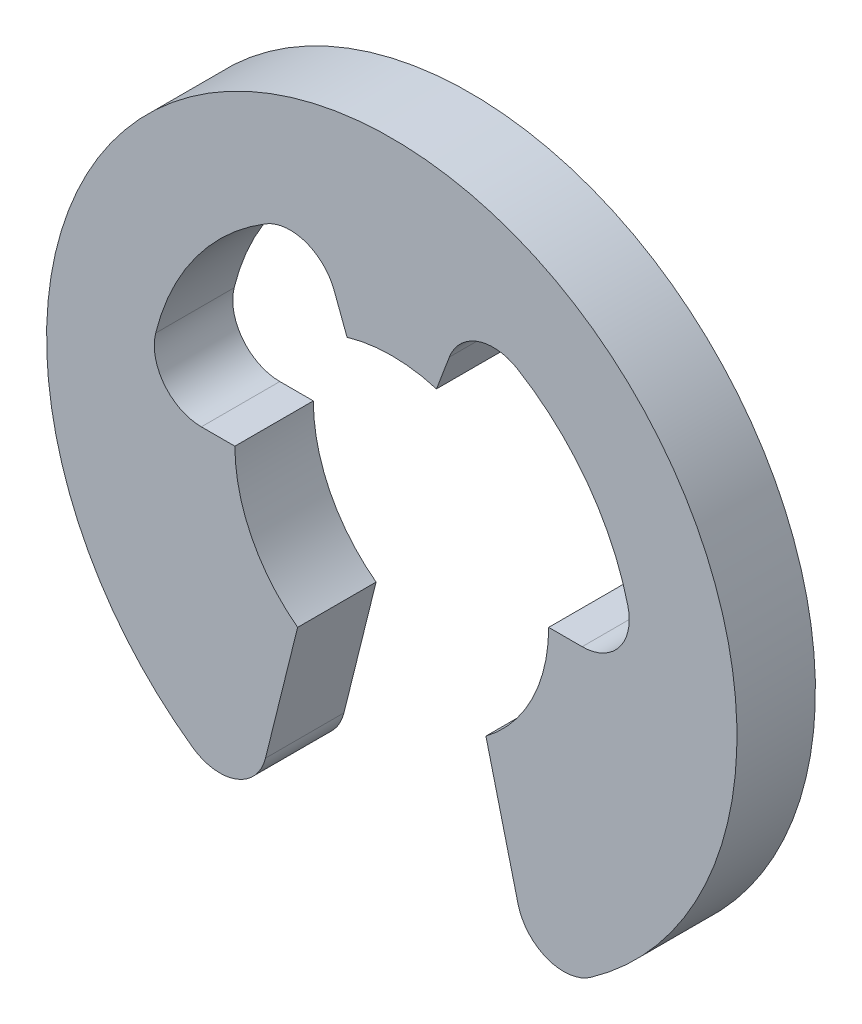
ISO-10303-21;
HEADER;
FILE_DESCRIPTION(('STEP AP214'),'2;1');
FILE_NAME('part.step','',(''),(''),'','','');
FILE_SCHEMA(('AUTOMOTIVE_DESIGN { 1 0 10303 214 1 1 1 1 }'));
ENDSEC;
DATA;
#1=APPLICATION_CONTEXT('core data for automotive mechanical design processes');
#2=APPLICATION_PROTOCOL_DEFINITION('international standard','automotive_design',2000,#1);
#3=PRODUCT_CONTEXT('',#1,'mechanical');
#4=PRODUCT('Part','Part','',(#3));
#5=PRODUCT_RELATED_PRODUCT_CATEGORY('part','',(#4));
#6=PRODUCT_DEFINITION_FORMATION('','',#4);
#7=PRODUCT_DEFINITION_CONTEXT('part definition',#1,'design');
#8=PRODUCT_DEFINITION('design','',#6,#7);
#9=PRODUCT_DEFINITION_SHAPE('','',#8);
#10=(LENGTH_UNIT() NAMED_UNIT(*) SI_UNIT(.MILLI.,.METRE.));
#11=(NAMED_UNIT(*) PLANE_ANGLE_UNIT() SI_UNIT($,.RADIAN.));
#12=(NAMED_UNIT(*) SI_UNIT($,.STERADIAN.) SOLID_ANGLE_UNIT());
#13=UNCERTAINTY_MEASURE_WITH_UNIT(LENGTH_MEASURE(1.E-05),#10,'distance_accuracy_value','');
#14=(GEOMETRIC_REPRESENTATION_CONTEXT(3) GLOBAL_UNCERTAINTY_ASSIGNED_CONTEXT((#13)) GLOBAL_UNIT_ASSIGNED_CONTEXT((#10,
#11,#12)) REPRESENTATION_CONTEXT('',''));
#15=CARTESIAN_POINT('',(0.,0.,0.));
#16=DIRECTION('',(0.,0.,1.));
#17=DIRECTION('',(1.,0.,0.));
#18=AXIS2_PLACEMENT_3D('',#15,#16,#17);
#19=CARTESIAN_POINT('',(0.,0.,0.5));
#20=DIRECTION('',(0.,0.,-1.));
#21=DIRECTION('',(-1.,0.,0.));
#22=AXIS2_PLACEMENT_3D('',#19,#20,#21);
#23=CYLINDRICAL_SURFACE('',#22,1.);
#24=CARTESIAN_POINT('',(0.,0.,0.));
#25=DIRECTION('',(0.,0.,-1.));
#26=DIRECTION('',(1.,0.,0.));
#27=AXIS2_PLACEMENT_3D('',#24,#25,#26);
#28=CIRCLE('',#27,1.);
#29=CARTESIAN_POINT('',(1.,0.,0.));
#30=VERTEX_POINT('',#29);
#31=CARTESIAN_POINT('',(0.6,-0.8,0.));
#32=VERTEX_POINT('',#31);
#33=EDGE_CURVE('E181',#30,#32,#28,.T.);
#34=ORIENTED_EDGE('',*,*,#33,.T.);
#35=DIRECTION('',(0.,0.,-1.));
#36=VECTOR('',#35,1.);
#37=CARTESIAN_POINT('',(0.6,-0.8,0.5));
#38=LINE('',#37,#36);
#39=CARTESIAN_POINT('',(0.6,-0.8,0.5));
#40=VERTEX_POINT('',#39);
#41=EDGE_CURVE('E163',#40,#32,#38,.T.);
#42=ORIENTED_EDGE('',*,*,#41,.F.);
#43=CARTESIAN_POINT('',(0.,0.,0.5));
#44=DIRECTION('',(0.,0.,-1.));
#45=DIRECTION('',(1.,0.,0.));
#46=AXIS2_PLACEMENT_3D('',#43,#44,#45);
#47=CIRCLE('',#46,1.);
#48=CARTESIAN_POINT('',(1.,0.,0.5));
#49=VERTEX_POINT('',#48);
#50=EDGE_CURVE('E168',#49,#40,#47,.T.);
#51=ORIENTED_EDGE('',*,*,#50,.F.);
#52=DIRECTION('',(0.,0.,-1.));
#53=VECTOR('',#52,1.);
#54=CARTESIAN_POINT('',(1.,0.,0.5));
#55=LINE('',#54,#53);
#56=EDGE_CURVE('E277',#49,#30,#55,.T.);
#57=ORIENTED_EDGE('',*,*,#56,.T.);
#58=EDGE_LOOP('',(#34,#42,#51,#57));
#59=FACE_BOUND('',#58,.T.);
#60=ADVANCED_FACE('F34',(#59),#23,.F.);
#61=CARTESIAN_POINT('',(0.6,-0.8,0.5));
#62=DIRECTION('',(0.970506473468542,0.241075060833039,0.));
#63=DIRECTION('',(-0.241075060833039,0.970506473468543,0.));
#64=AXIS2_PLACEMENT_3D('',#61,#62,#63);
#65=PLANE('',#64);
#66=DIRECTION('',(0.241075060833039,-0.970506473468542,0.));
#67=VECTOR('',#66,1.);
#68=CARTESIAN_POINT('',(0.6,-0.8,0.));
#69=LINE('',#68,#67);
#70=CARTESIAN_POINT('',(0.804780950730779,-1.62439567842692,0.));
#71=VERTEX_POINT('',#70);
#72=EDGE_CURVE('E279',#32,#71,#69,.T.);
#73=ORIENTED_EDGE('',*,*,#72,.T.);
#74=DIRECTION('',(0.,0.,-1.));
#75=VECTOR('',#74,1.);
#76=CARTESIAN_POINT('',(0.804780950730779,-1.62439567842692,0.5));
#77=LINE('',#76,#75);
#78=CARTESIAN_POINT('',(0.804780950730779,-1.62439567842692,0.5));
#79=VERTEX_POINT('',#78);
#80=EDGE_CURVE('E57',#71,#79,#77,.F.);
#81=ORIENTED_EDGE('',*,*,#80,.T.);
#82=DIRECTION('',(0.241075060833039,-0.970506473468542,0.));
#83=VECTOR('',#82,1.);
#84=CARTESIAN_POINT('',(0.6,-0.8,0.5));
#85=LINE('',#84,#83);
#86=EDGE_CURVE('E159',#40,#79,#85,.T.);
#87=ORIENTED_EDGE('',*,*,#86,.F.);
#88=ORIENTED_EDGE('',*,*,#41,.T.);
#89=EDGE_LOOP('',(#73,#81,#87,#88));
#90=FACE_BOUND('',#89,.T.);
#91=ADVANCED_FACE('F161',(#90),#65,.F.);
#92=CARTESIAN_POINT('',(0.,0.,0.5));
#93=DIRECTION('',(0.,0.,-1.));
#94=DIRECTION('',(-1.,0.,0.));
#95=AXIS2_PLACEMENT_3D('',#92,#93,#94);
#96=CYLINDRICAL_SURFACE('',#95,2.2);
#97=CARTESIAN_POINT('',(0.,0.,0.));
#98=DIRECTION('',(0.,0.,1.));
#99=DIRECTION('',(1.,0.,0.));
#100=AXIS2_PLACEMENT_3D('',#97,#98,#99);
#101=CIRCLE('',#100,2.2);
#102=CARTESIAN_POINT('',(1.26897492847208,-1.79713734336285,0.));
#103=VERTEX_POINT('',#102);
#104=CARTESIAN_POINT('',(-1.26897492847208,-1.79713734336285,0.));
#105=VERTEX_POINT('',#104);
#106=EDGE_CURVE('E281',#103,#105,#101,.T.);
#107=ORIENTED_EDGE('',*,*,#106,.T.);
#108=DIRECTION('',(0.,0.,-1.));
#109=VECTOR('',#108,1.);
#110=CARTESIAN_POINT('',(-1.26897492847208,-1.79713734336285,0.5));
#111=LINE('',#110,#109);
#112=CARTESIAN_POINT('',(-1.26897492847208,-1.79713734336285,0.5));
#113=VERTEX_POINT('',#112);
#114=EDGE_CURVE('E217',#105,#113,#111,.F.);
#115=ORIENTED_EDGE('',*,*,#114,.T.);
#116=CARTESIAN_POINT('',(0.,0.,0.5));
#117=DIRECTION('',(0.,0.,1.));
#118=DIRECTION('',(1.,0.,0.));
#119=AXIS2_PLACEMENT_3D('',#116,#117,#118);
#120=CIRCLE('',#119,2.2);
#121=CARTESIAN_POINT('',(1.26897492847208,-1.79713734336285,0.5));
#122=VERTEX_POINT('',#121);
#123=EDGE_CURVE('E167',#122,#113,#120,.T.);
#124=ORIENTED_EDGE('',*,*,#123,.F.);
#125=DIRECTION('',(0.,0.,-1.));
#126=VECTOR('',#125,1.);
#127=CARTESIAN_POINT('',(1.26897492847208,-1.79713734336285,0.5));
#128=LINE('',#127,#126);
#129=EDGE_CURVE('E214',#122,#103,#128,.T.);
#130=ORIENTED_EDGE('',*,*,#129,.T.);
#131=EDGE_LOOP('',(#107,#115,#124,#130));
#132=FACE_BOUND('',#131,.T.);
#133=ADVANCED_FACE('F342',(#132),#96,.T.);
#134=CARTESIAN_POINT('',(-0.6,-0.8,0.5));
#135=DIRECTION('',(-0.970506473468542,0.241075060833039,0.));
#136=DIRECTION('',(-0.241075060833039,-0.970506473468543,0.));
#137=AXIS2_PLACEMENT_3D('',#134,#135,#136);
#138=PLANE('',#137);
#139=DIRECTION('',(0.241075060833039,0.970506473468542,0.));
#140=VECTOR('',#139,1.);
#141=CARTESIAN_POINT('',(-0.6,-0.8,0.5));
#142=LINE('',#141,#140);
#143=CARTESIAN_POINT('',(-0.804780950730779,-1.62439567842692,0.5));
#144=VERTEX_POINT('',#143);
#145=CARTESIAN_POINT('',(-0.6,-0.8,0.5));
#146=VERTEX_POINT('',#145);
#147=EDGE_CURVE('E344',#144,#146,#142,.T.);
#148=ORIENTED_EDGE('',*,*,#147,.F.);
#149=DIRECTION('',(0.,0.,-1.));
#150=VECTOR('',#149,1.);
#151=CARTESIAN_POINT('',(-0.804780950730779,-1.62439567842692,0.5));
#152=LINE('',#151,#150);
#153=CARTESIAN_POINT('',(-0.804780950730779,-1.62439567842692,0.));
#154=VERTEX_POINT('',#153);
#155=EDGE_CURVE('E207',#144,#154,#152,.T.);
#156=ORIENTED_EDGE('',*,*,#155,.T.);
#157=DIRECTION('',(0.241075060833039,0.970506473468542,0.));
#158=VECTOR('',#157,1.);
#159=CARTESIAN_POINT('',(-0.6,-0.8,0.));
#160=LINE('',#159,#158);
#161=CARTESIAN_POINT('',(-0.6,-0.8,0.));
#162=VERTEX_POINT('',#161);
#163=EDGE_CURVE('E284',#154,#162,#160,.T.);
#164=ORIENTED_EDGE('',*,*,#163,.T.);
#165=DIRECTION('',(0.,0.,-1.));
#166=VECTOR('',#165,1.);
#167=CARTESIAN_POINT('',(-0.6,-0.8,0.5));
#168=LINE('',#167,#166);
#169=EDGE_CURVE('E183',#146,#162,#168,.T.);
#170=ORIENTED_EDGE('',*,*,#169,.F.);
#171=EDGE_LOOP('',(#148,#156,#164,#170));
#172=FACE_BOUND('',#171,.T.);
#173=ADVANCED_FACE('F353',(#172),#138,.F.);
#174=CARTESIAN_POINT('',(0.,0.,0.5));
#175=DIRECTION('',(0.,0.,-1.));
#176=DIRECTION('',(-1.,0.,0.));
#177=AXIS2_PLACEMENT_3D('',#174,#175,#176);
#178=CYLINDRICAL_SURFACE('',#177,1.);
#179=CARTESIAN_POINT('',(0.,0.,0.));
#180=DIRECTION('',(0.,0.,-1.));
#181=DIRECTION('',(1.,0.,0.));
#182=AXIS2_PLACEMENT_3D('',#179,#180,#181);
#183=CIRCLE('',#182,1.);
#184=CARTESIAN_POINT('',(-1.,0.,0.));
#185=VERTEX_POINT('',#184);
#186=EDGE_CURVE('E250',#162,#185,#183,.T.);
#187=ORIENTED_EDGE('',*,*,#186,.T.);
#188=DIRECTION('',(0.,0.,-1.));
#189=VECTOR('',#188,1.);
#190=CARTESIAN_POINT('',(-1.,0.,0.5));
#191=LINE('',#190,#189);
#192=CARTESIAN_POINT('',(-1.,0.,0.5));
#193=VERTEX_POINT('',#192);
#194=EDGE_CURVE('E189',#193,#185,#191,.T.);
#195=ORIENTED_EDGE('',*,*,#194,.F.);
#196=CARTESIAN_POINT('',(0.,0.,0.5));
#197=DIRECTION('',(0.,0.,-1.));
#198=DIRECTION('',(1.,0.,0.));
#199=AXIS2_PLACEMENT_3D('',#196,#197,#198);
#200=CIRCLE('',#199,1.);
#201=EDGE_CURVE('E265',#146,#193,#200,.T.);
#202=ORIENTED_EDGE('',*,*,#201,.F.);
#203=ORIENTED_EDGE('',*,*,#169,.T.);
#204=EDGE_LOOP('',(#187,#195,#202,#203));
#205=FACE_BOUND('',#204,.T.);
#206=ADVANCED_FACE('F351',(#205),#178,.F.);
#207=CARTESIAN_POINT('',(-1.,0.,0.5));
#208=DIRECTION('',(0.,-1.,0.));
#209=DIRECTION('',(0.,0.,-1.));
#210=AXIS2_PLACEMENT_3D('',#207,#208,#209);
#211=PLANE('',#210);
#212=DIRECTION('',(-1.,0.,0.));
#213=VECTOR('',#212,1.);
#214=CARTESIAN_POINT('',(-1.,0.,0.));
#215=LINE('',#214,#213);
#216=CARTESIAN_POINT('',(-1.21346610995116,0.,0.));
#217=VERTEX_POINT('',#216);
#218=EDGE_CURVE('E242',#185,#217,#215,.T.);
#219=ORIENTED_EDGE('',*,*,#218,.T.);
#220=DIRECTION('',(0.,0.,1.));
#221=VECTOR('',#220,1.);
#222=CARTESIAN_POINT('',(-1.21346610995116,0.,0.5));
#223=LINE('',#222,#221);
#224=CARTESIAN_POINT('',(-1.21346610995116,0.,0.5));
#225=VERTEX_POINT('',#224);
#226=EDGE_CURVE('E49',#217,#225,#223,.T.);
#227=ORIENTED_EDGE('',*,*,#226,.T.);
#228=DIRECTION('',(-1.,0.,0.));
#229=VECTOR('',#228,1.);
#230=CARTESIAN_POINT('',(-1.,0.,0.5));
#231=LINE('',#230,#229);
#232=EDGE_CURVE('E257',#193,#225,#231,.T.);
#233=ORIENTED_EDGE('',*,*,#232,.F.);
#234=ORIENTED_EDGE('',*,*,#194,.T.);
#235=EDGE_LOOP('',(#219,#227,#233,#234));
#236=FACE_BOUND('',#235,.T.);
#237=ADVANCED_FACE('F248',(#236),#211,.F.);
#238=CARTESIAN_POINT('',(0.,0.,0.5));
#239=DIRECTION('',(0.,0.,-1.));
#240=DIRECTION('',(-1.,0.,0.));
#241=AXIS2_PLACEMENT_3D('',#238,#239,#240);
#242=CYLINDRICAL_SURFACE('',#241,1.55);
#243=CARTESIAN_POINT('',(0.,0.,0.));
#244=DIRECTION('',(0.,0.,-1.));
#245=DIRECTION('',(1.,0.,0.));
#246=AXIS2_PLACEMENT_3D('',#243,#244,#245);
#247=CIRCLE('',#246,1.55);
#248=CARTESIAN_POINT('',(-1.50469797633944,0.372,0.));
#249=VERTEX_POINT('',#248);
#250=CARTESIAN_POINT('',(-0.802932995050076,1.32581997475521,0.));
#251=VERTEX_POINT('',#250);
#252=EDGE_CURVE('E244',#249,#251,#247,.T.);
#253=ORIENTED_EDGE('',*,*,#252,.T.);
#254=DIRECTION('',(0.,0.,-1.));
#255=VECTOR('',#254,1.);
#256=CARTESIAN_POINT('',(-0.802932995050076,1.32581997475521,0.5));
#257=LINE('',#256,#255);
#258=CARTESIAN_POINT('',(-0.802932995050076,1.32581997475521,0.5));
#259=VERTEX_POINT('',#258);
#260=EDGE_CURVE('E203',#251,#259,#257,.F.);
#261=ORIENTED_EDGE('',*,*,#260,.T.);
#262=CARTESIAN_POINT('',(0.,0.,0.5));
#263=DIRECTION('',(0.,0.,-1.));
#264=DIRECTION('',(1.,0.,0.));
#265=AXIS2_PLACEMENT_3D('',#262,#263,#264);
#266=CIRCLE('',#265,1.55);
#267=CARTESIAN_POINT('',(-1.50469797633944,0.372,0.5));
#268=VERTEX_POINT('',#267);
#269=EDGE_CURVE('E255',#268,#259,#266,.T.);
#270=ORIENTED_EDGE('',*,*,#269,.F.);
#271=DIRECTION('',(0.,0.,-1.));
#272=VECTOR('',#271,1.);
#273=CARTESIAN_POINT('',(-1.50469797633944,0.372,0.5));
#274=LINE('',#273,#272);
#275=EDGE_CURVE('E200',#268,#249,#274,.T.);
#276=ORIENTED_EDGE('',*,*,#275,.T.);
#277=EDGE_LOOP('',(#253,#261,#270,#276));
#278=FACE_BOUND('',#277,.T.);
#279=ADVANCED_FACE('F259',(#278),#242,.F.);
#280=CARTESIAN_POINT('',(-0.479739085185078,1.47388955154238,0.5));
#281=DIRECTION('',(0.935444030829867,0.353474843779258,0.));
#282=DIRECTION('',(-0.353474843779258,0.935444030829867,0.));
#283=AXIS2_PLACEMENT_3D('',#280,#281,#282);
#284=PLANE('',#283);
#285=DIRECTION('',(0.353474843779258,-0.935444030829867,0.));
#286=VECTOR('',#285,1.);
#287=CARTESIAN_POINT('',(-0.479739085185078,1.47388955154238,0.5));
#288=LINE('',#287,#286);
#289=CARTESIAN_POINT('',(-0.366893399662391,1.17525211019443,0.5));
#290=VERTEX_POINT('',#289);
#291=CARTESIAN_POINT('',(-0.285,0.958527516558602,0.5));
#292=VERTEX_POINT('',#291);
#293=EDGE_CURVE('E261',#290,#292,#288,.T.);
#294=ORIENTED_EDGE('',*,*,#293,.F.);
#295=DIRECTION('',(0.,0.,1.));
#296=VECTOR('',#295,1.);
#297=CARTESIAN_POINT('',(-0.366893399662391,1.17525211019443,0.));
#298=LINE('',#297,#296);
#299=CARTESIAN_POINT('',(-0.366893399662391,1.17525211019443,0.));
#300=VERTEX_POINT('',#299);
#301=EDGE_CURVE('E197',#290,#300,#298,.F.);
#302=ORIENTED_EDGE('',*,*,#301,.T.);
#303=DIRECTION('',(0.353474843779258,-0.935444030829867,0.));
#304=VECTOR('',#303,1.);
#305=CARTESIAN_POINT('',(-0.479739085185078,1.47388955154238,0.));
#306=LINE('',#305,#304);
#307=CARTESIAN_POINT('',(-0.285,0.958527516558602,0.));
#308=VERTEX_POINT('',#307);
#309=EDGE_CURVE('E288',#300,#308,#306,.T.);
#310=ORIENTED_EDGE('',*,*,#309,.T.);
#311=DIRECTION('',(0.,0.,-1.));
#312=VECTOR('',#311,1.);
#313=CARTESIAN_POINT('',(-0.285,0.958527516558602,0.5));
#314=LINE('',#313,#312);
#315=EDGE_CURVE('E303',#292,#308,#314,.T.);
#316=ORIENTED_EDGE('',*,*,#315,.F.);
#317=EDGE_LOOP('',(#294,#302,#310,#316));
#318=FACE_BOUND('',#317,.T.);
#319=ADVANCED_FACE('F380',(#318),#284,.F.);
#320=CARTESIAN_POINT('',(0.,0.,0.5));
#321=DIRECTION('',(0.,0.,-1.));
#322=DIRECTION('',(-1.,0.,0.));
#323=AXIS2_PLACEMENT_3D('',#320,#321,#322);
#324=CYLINDRICAL_SURFACE('',#323,1.);
#325=CARTESIAN_POINT('',(0.,0.,0.));
#326=DIRECTION('',(0.,0.,-1.));
#327=DIRECTION('',(1.,0.,0.));
#328=AXIS2_PLACEMENT_3D('',#325,#326,#327);
#329=CIRCLE('',#328,1.);
#330=CARTESIAN_POINT('',(0.285,0.958527516558601,0.));
#331=VERTEX_POINT('',#330);
#332=EDGE_CURVE('E290',#308,#331,#329,.T.);
#333=ORIENTED_EDGE('',*,*,#332,.T.);
#334=DIRECTION('',(0.,0.,-1.));
#335=VECTOR('',#334,1.);
#336=CARTESIAN_POINT('',(0.285,0.958527516558601,0.5));
#337=LINE('',#336,#335);
#338=CARTESIAN_POINT('',(0.285,0.958527516558601,0.5));
#339=VERTEX_POINT('',#338);
#340=EDGE_CURVE('E300',#339,#331,#337,.T.);
#341=ORIENTED_EDGE('',*,*,#340,.F.);
#342=CARTESIAN_POINT('',(0.,0.,0.5));
#343=DIRECTION('',(0.,0.,-1.));
#344=DIRECTION('',(1.,0.,0.));
#345=AXIS2_PLACEMENT_3D('',#342,#343,#344);
#346=CIRCLE('',#345,1.);
#347=EDGE_CURVE('E263',#292,#339,#346,.T.);
#348=ORIENTED_EDGE('',*,*,#347,.F.);
#349=ORIENTED_EDGE('',*,*,#315,.T.);
#350=EDGE_LOOP('',(#333,#341,#348,#349));
#351=FACE_BOUND('',#350,.T.);
#352=ADVANCED_FACE('F309',(#351),#324,.F.);
#353=CARTESIAN_POINT('',(0.479739085185078,1.47388955154238,0.5));
#354=DIRECTION('',(-0.935444030829867,0.353474843779258,0.));
#355=DIRECTION('',(-0.353474843779258,-0.935444030829867,0.));
#356=AXIS2_PLACEMENT_3D('',#353,#354,#355);
#357=PLANE('',#356);
#358=DIRECTION('',(0.353474843779258,0.935444030829867,0.));
#359=VECTOR('',#358,1.);
#360=CARTESIAN_POINT('',(0.479739085185078,1.47388955154238,0.));
#361=LINE('',#360,#359);
#362=CARTESIAN_POINT('',(0.366893399662391,1.17525211019443,0.));
#363=VERTEX_POINT('',#362);
#364=EDGE_CURVE('E292',#331,#363,#361,.T.);
#365=ORIENTED_EDGE('',*,*,#364,.T.);
#366=DIRECTION('',(0.,0.,1.));
#367=VECTOR('',#366,1.);
#368=CARTESIAN_POINT('',(0.366893399662391,1.17525211019443,0.5));
#369=LINE('',#368,#367);
#370=CARTESIAN_POINT('',(0.366893399662391,1.17525211019443,0.5));
#371=VERTEX_POINT('',#370);
#372=EDGE_CURVE('E205',#363,#371,#369,.T.);
#373=ORIENTED_EDGE('',*,*,#372,.T.);
#374=DIRECTION('',(0.353474843779258,0.935444030829867,0.));
#375=VECTOR('',#374,1.);
#376=CARTESIAN_POINT('',(0.479739085185078,1.47388955154238,0.5));
#377=LINE('',#376,#375);
#378=EDGE_CURVE('E270',#339,#371,#377,.T.);
#379=ORIENTED_EDGE('',*,*,#378,.F.);
#380=ORIENTED_EDGE('',*,*,#340,.T.);
#381=EDGE_LOOP('',(#365,#373,#379,#380));
#382=FACE_BOUND('',#381,.T.);
#383=ADVANCED_FACE('F318',(#382),#357,.F.);
#384=CARTESIAN_POINT('',(0.,0.,0.5));
#385=DIRECTION('',(0.,0.,-1.));
#386=DIRECTION('',(-1.,0.,0.));
#387=AXIS2_PLACEMENT_3D('',#384,#385,#386);
#388=CYLINDRICAL_SURFACE('',#387,1.55);
#389=CARTESIAN_POINT('',(0.,0.,0.));
#390=DIRECTION('',(0.,0.,-1.));
#391=DIRECTION('',(1.,0.,0.));
#392=AXIS2_PLACEMENT_3D('',#389,#390,#391);
#393=CIRCLE('',#392,1.55);
#394=CARTESIAN_POINT('',(0.802932995050076,1.32581997475521,0.));
#395=VERTEX_POINT('',#394);
#396=CARTESIAN_POINT('',(1.50469797633944,0.372,0.));
#397=VERTEX_POINT('',#396);
#398=EDGE_CURVE('E295',#395,#397,#393,.T.);
#399=ORIENTED_EDGE('',*,*,#398,.T.);
#400=DIRECTION('',(0.,0.,-1.));
#401=VECTOR('',#400,1.);
#402=CARTESIAN_POINT('',(1.50469797633944,0.372,0.5));
#403=LINE('',#402,#401);
#404=CARTESIAN_POINT('',(1.50469797633944,0.372,0.5));
#405=VERTEX_POINT('',#404);
#406=EDGE_CURVE('E195',#397,#405,#403,.F.);
#407=ORIENTED_EDGE('',*,*,#406,.T.);
#408=CARTESIAN_POINT('',(0.,0.,0.5));
#409=DIRECTION('',(0.,0.,-1.));
#410=DIRECTION('',(1.,0.,0.));
#411=AXIS2_PLACEMENT_3D('',#408,#409,#410);
#412=CIRCLE('',#411,1.55);
#413=CARTESIAN_POINT('',(0.802932995050076,1.32581997475521,0.5));
#414=VERTEX_POINT('',#413);
#415=EDGE_CURVE('E273',#414,#405,#412,.T.);
#416=ORIENTED_EDGE('',*,*,#415,.F.);
#417=DIRECTION('',(0.,0.,-1.));
#418=VECTOR('',#417,1.);
#419=CARTESIAN_POINT('',(0.802932995050076,1.32581997475521,0.5));
#420=LINE('',#419,#418);
#421=EDGE_CURVE('E186',#414,#395,#420,.T.);
#422=ORIENTED_EDGE('',*,*,#421,.T.);
#423=EDGE_LOOP('',(#399,#407,#416,#422));
#424=FACE_BOUND('',#423,.T.);
#425=ADVANCED_FACE('F327',(#424),#388,.F.);
#426=CARTESIAN_POINT('',(1.,0.,0.5));
#427=DIRECTION('',(0.,-1.,0.));
#428=DIRECTION('',(0.,0.,-1.));
#429=AXIS2_PLACEMENT_3D('',#426,#427,#428);
#430=PLANE('',#429);
#431=DIRECTION('',(-1.,0.,0.));
#432=VECTOR('',#431,1.);
#433=CARTESIAN_POINT('',(1.,0.,0.5));
#434=LINE('',#433,#432);
#435=CARTESIAN_POINT('',(1.21346610995116,0.,0.5));
#436=VERTEX_POINT('',#435);
#437=EDGE_CURVE('E174',#436,#49,#434,.T.);
#438=ORIENTED_EDGE('',*,*,#437,.F.);
#439=DIRECTION('',(0.,0.,1.));
#440=VECTOR('',#439,1.);
#441=CARTESIAN_POINT('',(1.21346610995116,0.,0.));
#442=LINE('',#441,#440);
#443=CARTESIAN_POINT('',(1.21346610995116,0.,0.));
#444=VERTEX_POINT('',#443);
#445=EDGE_CURVE('E182',#436,#444,#442,.F.);
#446=ORIENTED_EDGE('',*,*,#445,.T.);
#447=DIRECTION('',(-1.,0.,0.));
#448=VECTOR('',#447,1.);
#449=CARTESIAN_POINT('',(1.,0.,0.));
#450=LINE('',#449,#448);
#451=EDGE_CURVE('E178',#444,#30,#450,.T.);
#452=ORIENTED_EDGE('',*,*,#451,.T.);
#453=ORIENTED_EDGE('',*,*,#56,.F.);
#454=EDGE_LOOP('',(#438,#446,#452,#453));
#455=FACE_BOUND('',#454,.T.);
#456=ADVANCED_FACE('F333',(#455),#430,.F.);
#457=CARTESIAN_POINT('',(0.,0.,0.5));
#458=DIRECTION('',(0.,0.,1.));
#459=DIRECTION('',(1.,0.,0.));
#460=AXIS2_PLACEMENT_3D('',#457,#458,#459);
#461=PLANE('',#460);
#462=ORIENTED_EDGE('',*,*,#123,.T.);
#463=CARTESIAN_POINT('',(-1.09593289277134,-1.55207316017701,0.5));
#464=DIRECTION('',(0.,0.,1.));
#465=DIRECTION('',(1.,0.,0.));
#466=AXIS2_PLACEMENT_3D('',#463,#464,#465);
#467=CIRCLE('',#466,0.3);
#468=EDGE_CURVE('E221',#113,#144,#467,.T.);
#469=ORIENTED_EDGE('',*,*,#468,.T.);
#470=ORIENTED_EDGE('',*,*,#147,.T.);
#471=ORIENTED_EDGE('',*,*,#201,.T.);
#472=ORIENTED_EDGE('',*,*,#232,.T.);
#473=CARTESIAN_POINT('',(-1.21346610995116,0.3,0.5));
#474=DIRECTION('',(0.,0.,1.));
#475=DIRECTION('',(1.,0.,0.));
#476=AXIS2_PLACEMENT_3D('',#473,#474,#475);
#477=CIRCLE('',#476,0.3);
#478=EDGE_CURVE('E11',#225,#268,#477,.F.);
#479=ORIENTED_EDGE('',*,*,#478,.T.);
#480=ORIENTED_EDGE('',*,*,#269,.T.);
#481=CARTESIAN_POINT('',(-0.647526608911351,1.06920965706066,0.5));
#482=DIRECTION('',(0.,0.,1.));
#483=DIRECTION('',(1.,0.,0.));
#484=AXIS2_PLACEMENT_3D('',#481,#482,#483);
#485=CIRCLE('',#484,0.3);
#486=EDGE_CURVE('E231',#259,#290,#485,.F.);
#487=ORIENTED_EDGE('',*,*,#486,.T.);
#488=ORIENTED_EDGE('',*,*,#293,.T.);
#489=ORIENTED_EDGE('',*,*,#347,.T.);
#490=ORIENTED_EDGE('',*,*,#378,.T.);
#491=CARTESIAN_POINT('',(0.647526608911351,1.06920965706066,0.5));
#492=DIRECTION('',(0.,0.,1.));
#493=DIRECTION('',(1.,0.,0.));
#494=AXIS2_PLACEMENT_3D('',#491,#492,#493);
#495=CIRCLE('',#494,0.3);
#496=EDGE_CURVE('E235',#371,#414,#495,.F.);
#497=ORIENTED_EDGE('',*,*,#496,.T.);
#498=ORIENTED_EDGE('',*,*,#415,.T.);
#499=CARTESIAN_POINT('',(1.21346610995116,0.3,0.5));
#500=DIRECTION('',(0.,0.,1.));
#501=DIRECTION('',(1.,0.,0.));
#502=AXIS2_PLACEMENT_3D('',#499,#500,#501);
#503=CIRCLE('',#502,0.3);
#504=EDGE_CURVE('E227',#405,#436,#503,.F.);
#505=ORIENTED_EDGE('',*,*,#504,.T.);
#506=ORIENTED_EDGE('',*,*,#437,.T.);
#507=ORIENTED_EDGE('',*,*,#50,.T.);
#508=ORIENTED_EDGE('',*,*,#86,.T.);
#509=CARTESIAN_POINT('',(1.09593289277134,-1.55207316017701,0.5));
#510=DIRECTION('',(0.,0.,1.));
#511=DIRECTION('',(1.,0.,0.));
#512=AXIS2_PLACEMENT_3D('',#509,#510,#511);
#513=CIRCLE('',#512,0.3);
#514=EDGE_CURVE('E219',#79,#122,#513,.T.);
#515=ORIENTED_EDGE('',*,*,#514,.T.);
#516=EDGE_LOOP('',(#462,#469,#470,#471,#472,#479,#480,#487,#488,#489,#490,#497,#498,#505,#506,
#507,#508,#515));
#517=FACE_BOUND('',#516,.T.);
#518=ADVANCED_FACE('F172',(#517),#461,.T.);
#519=CARTESIAN_POINT('',(0.,0.,0.));
#520=DIRECTION('',(0.,0.,1.));
#521=DIRECTION('',(1.,0.,0.));
#522=AXIS2_PLACEMENT_3D('',#519,#520,#521);
#523=PLANE('',#522);
#524=ORIENTED_EDGE('',*,*,#163,.F.);
#525=CARTESIAN_POINT('',(-1.09593289277134,-1.55207316017701,0.));
#526=DIRECTION('',(0.,0.,1.));
#527=DIRECTION('',(1.,0.,0.));
#528=AXIS2_PLACEMENT_3D('',#525,#526,#527);
#529=CIRCLE('',#528,0.3);
#530=EDGE_CURVE('E212',#154,#105,#529,.F.);
#531=ORIENTED_EDGE('',*,*,#530,.T.);
#532=ORIENTED_EDGE('',*,*,#106,.F.);
#533=CARTESIAN_POINT('',(1.09593289277134,-1.55207316017701,0.));
#534=DIRECTION('',(0.,0.,1.));
#535=DIRECTION('',(1.,0.,0.));
#536=AXIS2_PLACEMENT_3D('',#533,#534,#535);
#537=CIRCLE('',#536,0.3);
#538=EDGE_CURVE('E210',#103,#71,#537,.F.);
#539=ORIENTED_EDGE('',*,*,#538,.T.);
#540=ORIENTED_EDGE('',*,*,#72,.F.);
#541=ORIENTED_EDGE('',*,*,#33,.F.);
#542=ORIENTED_EDGE('',*,*,#451,.F.);
#543=CARTESIAN_POINT('',(1.21346610995116,0.3,0.));
#544=DIRECTION('',(0.,0.,1.));
#545=DIRECTION('',(1.,0.,0.));
#546=AXIS2_PLACEMENT_3D('',#543,#544,#545);
#547=CIRCLE('',#546,0.3);
#548=EDGE_CURVE('E225',#444,#397,#547,.T.);
#549=ORIENTED_EDGE('',*,*,#548,.T.);
#550=ORIENTED_EDGE('',*,*,#398,.F.);
#551=CARTESIAN_POINT('',(0.647526608911351,1.06920965706066,0.));
#552=DIRECTION('',(0.,0.,1.));
#553=DIRECTION('',(1.,0.,0.));
#554=AXIS2_PLACEMENT_3D('',#551,#552,#553);
#555=CIRCLE('',#554,0.3);
#556=EDGE_CURVE('E233',#395,#363,#555,.T.);
#557=ORIENTED_EDGE('',*,*,#556,.T.);
#558=ORIENTED_EDGE('',*,*,#364,.F.);
#559=ORIENTED_EDGE('',*,*,#332,.F.);
#560=ORIENTED_EDGE('',*,*,#309,.F.);
#561=CARTESIAN_POINT('',(-0.647526608911351,1.06920965706066,0.));
#562=DIRECTION('',(0.,0.,1.));
#563=DIRECTION('',(1.,0.,0.));
#564=AXIS2_PLACEMENT_3D('',#561,#562,#563);
#565=CIRCLE('',#564,0.3);
#566=EDGE_CURVE('E229',#300,#251,#565,.T.);
#567=ORIENTED_EDGE('',*,*,#566,.T.);
#568=ORIENTED_EDGE('',*,*,#252,.F.);
#569=CARTESIAN_POINT('',(-1.21346610995116,0.3,0.));
#570=DIRECTION('',(0.,0.,1.));
#571=DIRECTION('',(1.,0.,0.));
#572=AXIS2_PLACEMENT_3D('',#569,#570,#571);
#573=CIRCLE('',#572,0.3);
#574=EDGE_CURVE('E42',#249,#217,#573,.T.);
#575=ORIENTED_EDGE('',*,*,#574,.T.);
#576=ORIENTED_EDGE('',*,*,#218,.F.);
#577=ORIENTED_EDGE('',*,*,#186,.F.);
#578=EDGE_LOOP('',(#524,#531,#532,#539,#540,#541,#542,#549,#550,#557,#558,#559,#560,#567,#568,
#575,#576,#577));
#579=FACE_BOUND('',#578,.T.);
#580=ADVANCED_FACE('F240',(#579),#523,.F.);
#581=CARTESIAN_POINT('',(1.21346610995116,0.3,0.5));
#582=DIRECTION('',(0.,0.,-1.));
#583=DIRECTION('',(-1.,0.,0.));
#584=AXIS2_PLACEMENT_3D('',#581,#582,#583);
#585=CYLINDRICAL_SURFACE('',#584,0.3);
#586=ORIENTED_EDGE('',*,*,#504,.F.);
#587=ORIENTED_EDGE('',*,*,#406,.F.);
#588=ORIENTED_EDGE('',*,*,#548,.F.);
#589=ORIENTED_EDGE('',*,*,#445,.F.);
#590=EDGE_LOOP('',(#586,#587,#588,#589));
#591=FACE_BOUND('',#590,.T.);
#592=ADVANCED_FACE('F330',(#591),#585,.F.);
#593=CARTESIAN_POINT('',(-0.647526608911351,1.06920965706066,0.5));
#594=DIRECTION('',(0.,0.,-1.));
#595=DIRECTION('',(-1.,0.,0.));
#596=AXIS2_PLACEMENT_3D('',#593,#594,#595);
#597=CYLINDRICAL_SURFACE('',#596,0.3);
#598=ORIENTED_EDGE('',*,*,#486,.F.);
#599=ORIENTED_EDGE('',*,*,#260,.F.);
#600=ORIENTED_EDGE('',*,*,#566,.F.);
#601=ORIENTED_EDGE('',*,*,#301,.F.);
#602=EDGE_LOOP('',(#598,#599,#600,#601));
#603=FACE_BOUND('',#602,.T.);
#604=ADVANCED_FACE('F363',(#603),#597,.F.);
#605=CARTESIAN_POINT('',(0.647526608911351,1.06920965706066,0.5));
#606=DIRECTION('',(0.,0.,-1.));
#607=DIRECTION('',(-1.,0.,0.));
#608=AXIS2_PLACEMENT_3D('',#605,#606,#607);
#609=CYLINDRICAL_SURFACE('',#608,0.3);
#610=ORIENTED_EDGE('',*,*,#496,.F.);
#611=ORIENTED_EDGE('',*,*,#372,.F.);
#612=ORIENTED_EDGE('',*,*,#556,.F.);
#613=ORIENTED_EDGE('',*,*,#421,.F.);
#614=EDGE_LOOP('',(#610,#611,#612,#613));
#615=FACE_BOUND('',#614,.T.);
#616=ADVANCED_FACE('F322',(#615),#609,.F.);
#617=CARTESIAN_POINT('',(-1.09593289277134,-1.55207316017701,0.5));
#618=DIRECTION('',(0.,0.,-1.));
#619=DIRECTION('',(-1.,0.,0.));
#620=AXIS2_PLACEMENT_3D('',#617,#618,#619);
#621=CYLINDRICAL_SURFACE('',#620,0.3);
#622=ORIENTED_EDGE('',*,*,#468,.F.);
#623=ORIENTED_EDGE('',*,*,#114,.F.);
#624=ORIENTED_EDGE('',*,*,#530,.F.);
#625=ORIENTED_EDGE('',*,*,#155,.F.);
#626=EDGE_LOOP('',(#622,#623,#624,#625));
#627=FACE_BOUND('',#626,.T.);
#628=ADVANCED_FACE('F356',(#627),#621,.T.);
#629=CARTESIAN_POINT('',(1.09593289277134,-1.55207316017701,0.5));
#630=DIRECTION('',(0.,0.,-1.));
#631=DIRECTION('',(-1.,0.,0.));
#632=AXIS2_PLACEMENT_3D('',#629,#630,#631);
#633=CYLINDRICAL_SURFACE('',#632,0.3);
#634=ORIENTED_EDGE('',*,*,#514,.F.);
#635=ORIENTED_EDGE('',*,*,#80,.F.);
#636=ORIENTED_EDGE('',*,*,#538,.F.);
#637=ORIENTED_EDGE('',*,*,#129,.F.);
#638=EDGE_LOOP('',(#634,#635,#636,#637));
#639=FACE_BOUND('',#638,.T.);
#640=ADVANCED_FACE('F337',(#639),#633,.T.);
#641=CARTESIAN_POINT('',(-1.21346610995116,0.3,0.5));
#642=DIRECTION('',(0.,0.,-1.));
#643=DIRECTION('',(-1.,0.,0.));
#644=AXIS2_PLACEMENT_3D('',#641,#642,#643);
#645=CYLINDRICAL_SURFACE('',#644,0.3);
#646=ORIENTED_EDGE('',*,*,#478,.F.);
#647=ORIENTED_EDGE('',*,*,#226,.F.);
#648=ORIENTED_EDGE('',*,*,#574,.F.);
#649=ORIENTED_EDGE('',*,*,#275,.F.);
#650=EDGE_LOOP('',(#646,#647,#648,#649));
#651=FACE_BOUND('',#650,.T.);
#652=ADVANCED_FACE('F36',(#651),#645,.F.);
#653=CLOSED_SHELL('',(#60,#91,#133,#173,#206,#237,#279,#319,#352,#383,#425,#456,#518,#580,#592,
#604,#616,#628,#640,#652));
#654=MANIFOLD_SOLID_BREP('B2',#653);
#655=ADVANCED_BREP_SHAPE_REPRESENTATION('',(#18,#654),#14);
#656=SHAPE_DEFINITION_REPRESENTATION(#9,#655);
ENDSEC;
END-ISO-10303-21;
